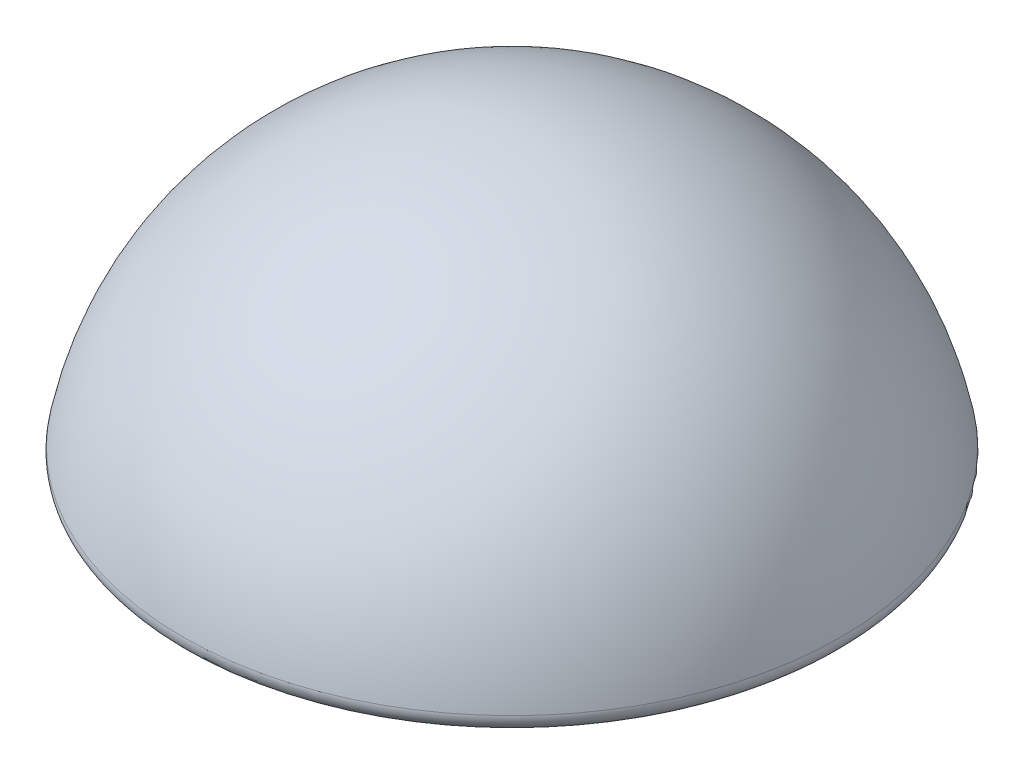
ISO-10303-21;
HEADER;
FILE_DESCRIPTION(('STEP AP214'),'2;1');
FILE_NAME('part.step','',(''),(''),'','','');
FILE_SCHEMA(('AUTOMOTIVE_DESIGN { 1 0 10303 214 1 1 1 1 }'));
ENDSEC;
DATA;
#1=APPLICATION_CONTEXT('core data for automotive mechanical design processes');
#2=APPLICATION_PROTOCOL_DEFINITION('international standard','automotive_design',2000,#1);
#3=PRODUCT_CONTEXT('',#1,'mechanical');
#4=PRODUCT('Part','Part','',(#3));
#5=PRODUCT_RELATED_PRODUCT_CATEGORY('part','',(#4));
#6=PRODUCT_DEFINITION_FORMATION('','',#4);
#7=PRODUCT_DEFINITION_CONTEXT('part definition',#1,'design');
#8=PRODUCT_DEFINITION('design','',#6,#7);
#9=PRODUCT_DEFINITION_SHAPE('','',#8);
#10=(LENGTH_UNIT() NAMED_UNIT(*) SI_UNIT(.MILLI.,.METRE.));
#11=(NAMED_UNIT(*) PLANE_ANGLE_UNIT() SI_UNIT($,.RADIAN.));
#12=(NAMED_UNIT(*) SI_UNIT($,.STERADIAN.) SOLID_ANGLE_UNIT());
#13=UNCERTAINTY_MEASURE_WITH_UNIT(LENGTH_MEASURE(1.E-05),#10,'distance_accuracy_value','');
#14=(GEOMETRIC_REPRESENTATION_CONTEXT(3) GLOBAL_UNCERTAINTY_ASSIGNED_CONTEXT((#13)) GLOBAL_UNIT_ASSIGNED_CONTEXT((#10,
#11,#12)) REPRESENTATION_CONTEXT('',''));
#15=CARTESIAN_POINT('',(0.,0.,0.));
#16=DIRECTION('',(0.,0.,1.));
#17=DIRECTION('',(1.,0.,0.));
#18=AXIS2_PLACEMENT_3D('',#15,#16,#17);
#19=CARTESIAN_POINT('',(0.,61.2522257059193,-40.1791717559268));
#20=DIRECTION('',(0.,-1.,0.));
#21=DIRECTION('',(0.,0.,-1.));
#22=AXIS2_PLACEMENT_3D('',#19,#20,#21);
#23=PLANE('',#22);
#24=DIRECTION('',(0.,0.,1.));
#25=VECTOR('',#24,1.);
#26=CARTESIAN_POINT('',(2.15,61.2522257059193,2.14999999999999));
#27=LINE('',#26,#25);
#28=CARTESIAN_POINT('',(2.15,61.2522257059193,-2.15000000000001));
#29=VERTEX_POINT('',#28);
#30=CARTESIAN_POINT('',(2.15,61.2522257059193,2.14999999999999));
#31=VERTEX_POINT('',#30);
#32=EDGE_CURVE('E61',#29,#31,#27,.T.);
#33=ORIENTED_EDGE('',*,*,#32,.F.);
#34=DIRECTION('',(1.,0.,0.));
#35=VECTOR('',#34,1.);
#36=CARTESIAN_POINT('',(-2.15,61.2522257059193,-2.15000000000001));
#37=LINE('',#36,#35);
#38=CARTESIAN_POINT('',(-2.15,61.2522257059193,-2.15000000000001));
#39=VERTEX_POINT('',#38);
#40=EDGE_CURVE('E133',#39,#29,#37,.T.);
#41=ORIENTED_EDGE('',*,*,#40,.F.);
#42=DIRECTION('',(0.,0.,-1.));
#43=VECTOR('',#42,1.);
#44=CARTESIAN_POINT('',(-2.15,61.2522257059193,2.14999999999999));
#45=LINE('',#44,#43);
#46=CARTESIAN_POINT('',(-2.15,61.2522257059193,2.14999999999999));
#47=VERTEX_POINT('',#46);
#48=EDGE_CURVE('E137',#47,#39,#45,.T.);
#49=ORIENTED_EDGE('',*,*,#48,.F.);
#50=DIRECTION('',(-1.,0.,0.));
#51=VECTOR('',#50,1.);
#52=CARTESIAN_POINT('',(-2.15,61.2522257059193,2.14999999999999));
#53=LINE('',#52,#51);
#54=EDGE_CURVE('E146',#31,#47,#53,.T.);
#55=ORIENTED_EDGE('',*,*,#54,.F.);
#56=EDGE_LOOP('',(#33,#41,#49,#55));
#57=FACE_BOUND('',#56,.T.);
#58=CARTESIAN_POINT('',(0.,61.2522257059193,0.));
#59=DIRECTION('',(0.,-1.,0.));
#60=DIRECTION('',(0.,0.,-1.));
#61=AXIS2_PLACEMENT_3D('',#58,#59,#60);
#62=CIRCLE('',#61,40.1791717559268);
#63=CARTESIAN_POINT('',(-40.1791717559268,61.2522257059193,0.));
#64=VERTEX_POINT('',#63);
#65=EDGE_CURVE('E54',#64,#64,#62,.T.);
#66=ORIENTED_EDGE('',*,*,#65,.T.);
#67=EDGE_LOOP('',(#66));
#68=FACE_BOUND('',#67,.T.);
#69=ADVANCED_FACE('F45',(#57,#68),#23,.T.);
#70=CARTESIAN_POINT('',(0.,47.4,0.));
#71=DIRECTION('',(0.,1.,0.));
#72=DIRECTION('',(-1.,0.,0.));
#73=AXIS2_PLACEMENT_3D('',#70,#71,#72);
#74=SPHERICAL_SURFACE('',#73,46.5);
#75=CARTESIAN_POINT('',(0.,56.2522257059193,0.));
#76=DIRECTION('',(0.,1.,0.));
#77=DIRECTION('',(0.,0.,1.));
#78=AXIS2_PLACEMENT_3D('',#75,#76,#77);
#79=CIRCLE('',#78,45.6496232191621);
#80=CARTESIAN_POINT('',(0.,56.2522257059193,45.6496232191621));
#81=VERTEX_POINT('',#80);
#82=EDGE_CURVE('E202',#81,#81,#79,.T.);
#83=ORIENTED_EDGE('',*,*,#82,.T.);
#84=EDGE_LOOP('',(#83));
#85=FACE_BOUND('',#84,.T.);
#86=ADVANCED_FACE('F47',(#85),#74,.T.);
#87=CARTESIAN_POINT('',(0.,55.8714848153422,0.));
#88=DIRECTION('',(0.,1.,0.));
#89=DIRECTION('',(0.,0.,1.));
#90=AXIS2_PLACEMENT_3D('',#87,#88,#89);
#91=TOROIDAL_SURFACE('',#90,43.6861985645744,2.00000000000001);
#92=CARTESIAN_POINT('',(0.,55.490743924765,0.));
#93=DIRECTION('',(0.,1.,0.));
#94=DIRECTION('',(0.,0.,1.));
#95=AXIS2_PLACEMENT_3D('',#92,#93,#94);
#96=CIRCLE('',#95,41.7227739099868);
#97=CARTESIAN_POINT('',(-41.7227739099868,55.490743924765,0.));
#98=VERTEX_POINT('',#97);
#99=EDGE_CURVE('E198',#98,#98,#96,.T.);
#100=ORIENTED_EDGE('',*,*,#99,.T.);
#101=EDGE_LOOP('',(#100));
#102=FACE_BOUND('',#101,.T.);
#103=ORIENTED_EDGE('',*,*,#82,.F.);
#104=EDGE_LOOP('',(#103));
#105=FACE_BOUND('',#104,.T.);
#106=ADVANCED_FACE('F213',(#102,#105),#91,.T.);
#107=CARTESIAN_POINT('',(0.,47.4,0.));
#108=DIRECTION('',(0.,1.,0.));
#109=DIRECTION('',(-1.,0.,0.));
#110=AXIS2_PLACEMENT_3D('',#107,#108,#109);
#111=SPHERICAL_SURFACE('',#110,42.5);
#112=CARTESIAN_POINT('',(-40.1791717559268,61.2522257059193,0.));
#113=CARTESIAN_POINT('',(-40.1994394092559,61.1934382228565,0.));
#114=CARTESIAN_POINT('',(-40.2195780399443,61.1346062577808,0.));
#115=CARTESIAN_POINT('',(-40.2595968719595,61.016854498442,0.));
#116=CARTESIAN_POINT('',(-40.2794770732863,60.9579347041788,0.));
#117=CARTESIAN_POINT('',(-40.3189786624983,60.8400084213034,0.));
#118=CARTESIAN_POINT('',(-40.3386000503835,60.781001932691,0.));
#119=CARTESIAN_POINT('',(-40.3775836349528,60.6629033980792,0.));
#120=CARTESIAN_POINT('',(-40.3969458316369,60.6038113520798,0.));
#121=CARTESIAN_POINT('',(-40.4354106606811,60.4855428411826,0.));
#122=CARTESIAN_POINT('',(-40.4545132930411,60.426366376285,0.));
#123=CARTESIAN_POINT('',(-40.4924586254105,60.3079301677395,0.));
#124=CARTESIAN_POINT('',(-40.51130132542,60.2486704240916,0.));
#125=CARTESIAN_POINT('',(-40.5487264300445,60.1300687997895,0.));
#126=CARTESIAN_POINT('',(-40.5673088346595,60.0707269191353,0.));
#127=CARTESIAN_POINT('',(-40.604212990473,59.9519621641491,0.));
#128=CARTESIAN_POINT('',(-40.6225347416715,59.8925392898171,0.));
#129=CARTESIAN_POINT('',(-40.6589172376501,59.7736136923638,0.));
#130=CARTESIAN_POINT('',(-40.6769779824302,59.7141109692425,0.));
#131=CARTESIAN_POINT('',(-40.7128381175994,59.5950268206379,0.));
#132=CARTESIAN_POINT('',(-40.7306375079885,59.5354453951544,0.));
#133=CARTESIAN_POINT('',(-40.7659745914382,59.4162049897689,0.));
#134=CARTESIAN_POINT('',(-40.7835122844989,59.3565460098667,0.));
#135=CARTESIAN_POINT('',(-40.8183256353967,59.2371516450813,0.));
#136=CARTESIAN_POINT('',(-40.8356012932338,59.177416260198,0.));
#137=CARTESIAN_POINT('',(-40.8698902408377,59.05787023636,0.));
#138=CARTESIAN_POINT('',(-40.8869035306046,58.9980595974054,0.));
#139=CARTESIAN_POINT('',(-40.9206674142764,58.8783642177842,0.));
#140=CARTESIAN_POINT('',(-40.9374180081814,58.8184794771178,0.));
#141=CARTESIAN_POINT('',(-40.9706561773991,58.6986370478604,0.));
#142=CARTESIAN_POINT('',(-40.9871437527118,58.6386793592695,0.));
#143=CARTESIAN_POINT('',(-41.0198555670822,58.518692189356,0.));
#144=CARTESIAN_POINT('',(-41.0360798061399,58.4586627080335,0.));
#145=CARTESIAN_POINT('',(-41.068264635411,58.3385331092327,0.));
#146=CARTESIAN_POINT('',(-41.0842252256245,58.2784329917545,0.));
#147=CARTESIAN_POINT('',(-41.1158824496977,58.1581632785793,0.));
#148=CARTESIAN_POINT('',(-41.1315790835575,58.0979936828824,0.));
#149=CARTESIAN_POINT('',(-41.1627080924993,57.9775861725454,0.));
#150=CARTESIAN_POINT('',(-41.1781404675814,57.9173482579054,0.));
#151=CARTESIAN_POINT('',(-41.2087406616356,57.796805270274,0.));
#152=CARTESIAN_POINT('',(-41.2239084806076,57.7365001972827,0.));
#153=CARTESIAN_POINT('',(-41.2539792702061,57.6158240548345,0.));
#154=CARTESIAN_POINT('',(-41.2688822408327,57.5554529853777,0.));
#155=CARTESIAN_POINT('',(-41.2984230466078,57.4346460131558,0.));
#156=CARTESIAN_POINT('',(-41.3130608817564,57.3742101103908,0.));
#157=CARTESIAN_POINT('',(-41.3420711345513,57.2532746359591,0.));
#158=CARTESIAN_POINT('',(-41.3564435521976,57.1927750642924,0.));
#159=CARTESIAN_POINT('',(-41.3849226930775,57.0717134176904,0.));
#160=CARTESIAN_POINT('',(-41.3990294163111,57.0111513427551,0.));
#161=CARTESIAN_POINT('',(-41.4269768965741,56.8899658564533,0.));
#162=CARTESIAN_POINT('',(-41.4408176536034,56.8293424450868,0.));
#163=CARTESIAN_POINT('',(-41.4682329347912,56.7080354539418,0.));
#164=CARTESIAN_POINT('',(-41.4818074589497,56.6473518741633,0.));
#165=CARTESIAN_POINT('',(-41.5086900128564,56.5259257153725,0.));
#166=CARTESIAN_POINT('',(-41.5219980426048,56.4651831363602,0.));
#167=CARTESIAN_POINT('',(-41.5483473512938,56.3436401494178,0.));
#168=CARTESIAN_POINT('',(-41.5613886302346,56.2828397414878,0.));
#169=CARTESIAN_POINT('',(-41.5872041860238,56.1611822681353,0.));
#170=CARTESIAN_POINT('',(-41.5999784628722,56.1003252027128,0.));
#171=CARTESIAN_POINT('',(-41.6252597684356,55.9785555869117,0.));
#172=CARTESIAN_POINT('',(-41.6377667971506,55.9176430365332,0.));
#173=CARTESIAN_POINT('',(-41.6625133651845,55.7957636243519,0.));
#174=CARTESIAN_POINT('',(-41.6747529045035,55.7347967625493,0.));
#175=CARTESIAN_POINT('',(-41.6989642590189,55.6128099023725,0.));
#176=CARTESIAN_POINT('',(-41.7109360742152,55.5517899039984,0.));
#177=CARTESIAN_POINT('',(-41.7227739099868,55.490743924765,0.));
#178=B_SPLINE_CURVE_WITH_KNOTS('',3,(#112,#113,#114,#115,#116,#117,#118,#119,#120,#121,#122,
#123,#124,#125,#126,#127,#128,#129,#130,#131,#132,#133,#134,#135,#136,#137,#138,#139,#140,#141,
#142,#143,#144,#145,#146,#147,#148,#149,#150,#151,#152,#153,#154,#155,#156,#157,#158,#159,#160,
#161,#162,#163,#164,#165,#166,#167,#168,#169,#170,#171,#172,#173,#174,#175,#176,#177),
.UNSPECIFIED.,.F.,.F.,(4,2,2,2,2,2,2,2,2,2,2,2,2,2,2,2,2,2,2,2,2,2,2,2,2,2,2,2,2,2,2,2,4),(0.,
0.186549343465838,0.373098686931691,0.559648030397529,0.746197373863375,0.932746717329217,
1.11929606079507,1.3058454042609,1.49239474772675,1.67894409119259,1.86549343465844,
2.05204277812429,2.23859212159013,2.42514146505597,2.61169080852182,2.79824015198766,
2.98478949545351,3.17133883891935,3.3578881823852,3.54443752585104,3.73098686931688,
3.91753621278273,4.10408555624858,4.29063489971442,4.47718424318026,4.6637335866461,
4.85028293011195,5.03683227357779,5.22338161704363,5.40993096050949,5.59648030397532,
5.78302964744117,5.96957899090702),.UNSPECIFIED.);
#179=EDGE_CURVE('BSEAM210',#64,#98,#178,.T.);
#180=ORIENTED_EDGE('',*,*,#65,.F.);
#181=ORIENTED_EDGE('',*,*,#99,.F.);
#182=ORIENTED_EDGE('',*,*,#179,.T.);
#183=ORIENTED_EDGE('',*,*,#179,.F.);
#184=EDGE_LOOP('',(#180,#182,#181,#183));
#185=FACE_BOUND('',#184,.T.);
#186=ADVANCED_FACE('F210',(#185),#111,.F.);
#187=CARTESIAN_POINT('',(2.15,64.2522257059193,2.14999999999999));
#188=DIRECTION('',(1.,0.,0.));
#189=DIRECTION('',(0.,0.,-1.));
#190=AXIS2_PLACEMENT_3D('',#187,#188,#189);
#191=PLANE('',#190);
#192=ORIENTED_EDGE('',*,*,#32,.T.);
#193=DIRECTION('',(0.,-1.,0.));
#194=VECTOR('',#193,1.);
#195=CARTESIAN_POINT('',(2.15,64.2522257059193,2.14999999999999));
#196=LINE('',#195,#194);
#197=CARTESIAN_POINT('',(2.15,64.2522257059193,2.14999999999999));
#198=VERTEX_POINT('',#197);
#199=EDGE_CURVE('E108',#198,#31,#196,.T.);
#200=ORIENTED_EDGE('',*,*,#199,.F.);
#201=DIRECTION('',(0.,0.,1.));
#202=VECTOR('',#201,1.);
#203=CARTESIAN_POINT('',(2.15,64.2522257059193,2.14999999999999));
#204=LINE('',#203,#202);
#205=CARTESIAN_POINT('',(2.15,64.2522257059193,-2.15000000000001));
#206=VERTEX_POINT('',#205);
#207=EDGE_CURVE('E112',#206,#198,#204,.T.);
#208=ORIENTED_EDGE('',*,*,#207,.F.);
#209=DIRECTION('',(0.,-1.,0.));
#210=VECTOR('',#209,1.);
#211=CARTESIAN_POINT('',(2.15,64.2522257059193,-2.15000000000001));
#212=LINE('',#211,#210);
#213=EDGE_CURVE('E152',#206,#29,#212,.T.);
#214=ORIENTED_EDGE('',*,*,#213,.T.);
#215=EDGE_LOOP('',(#192,#200,#208,#214));
#216=FACE_BOUND('',#215,.T.);
#217=ADVANCED_FACE('F110',(#216),#191,.F.);
#218=CARTESIAN_POINT('',(-2.15,64.2522257059193,-2.15000000000001));
#219=DIRECTION('',(0.,0.,-1.));
#220=DIRECTION('',(0.,1.,0.));
#221=AXIS2_PLACEMENT_3D('',#218,#219,#220);
#222=PLANE('',#221);
#223=ORIENTED_EDGE('',*,*,#40,.T.);
#224=ORIENTED_EDGE('',*,*,#213,.F.);
#225=DIRECTION('',(1.,0.,0.));
#226=VECTOR('',#225,1.);
#227=CARTESIAN_POINT('',(-2.15,64.2522257059193,-2.15000000000001));
#228=LINE('',#227,#226);
#229=CARTESIAN_POINT('',(-2.15,64.2522257059193,-2.15000000000001));
#230=VERTEX_POINT('',#229);
#231=EDGE_CURVE('E119',#230,#206,#228,.T.);
#232=ORIENTED_EDGE('',*,*,#231,.F.);
#233=DIRECTION('',(0.,-1.,0.));
#234=VECTOR('',#233,1.);
#235=CARTESIAN_POINT('',(-2.15,64.2522257059193,-2.15000000000001));
#236=LINE('',#235,#234);
#237=EDGE_CURVE('E156',#230,#39,#236,.T.);
#238=ORIENTED_EDGE('',*,*,#237,.T.);
#239=EDGE_LOOP('',(#223,#224,#232,#238));
#240=FACE_BOUND('',#239,.T.);
#241=ADVANCED_FACE('F252',(#240),#222,.F.);
#242=CARTESIAN_POINT('',(-2.15,64.2522257059193,2.14999999999999));
#243=DIRECTION('',(-1.,0.,0.));
#244=DIRECTION('',(0.,0.,1.));
#245=AXIS2_PLACEMENT_3D('',#242,#243,#244);
#246=PLANE('',#245);
#247=ORIENTED_EDGE('',*,*,#48,.T.);
#248=ORIENTED_EDGE('',*,*,#237,.F.);
#249=DIRECTION('',(0.,0.,-1.));
#250=VECTOR('',#249,1.);
#251=CARTESIAN_POINT('',(-2.15,64.2522257059193,2.14999999999999));
#252=LINE('',#251,#250);
#253=CARTESIAN_POINT('',(-2.15,64.2522257059193,2.14999999999999));
#254=VERTEX_POINT('',#253);
#255=EDGE_CURVE('E128',#254,#230,#252,.T.);
#256=ORIENTED_EDGE('',*,*,#255,.F.);
#257=DIRECTION('',(0.,-1.,0.));
#258=VECTOR('',#257,1.);
#259=CARTESIAN_POINT('',(-2.15,64.2522257059193,2.14999999999999));
#260=LINE('',#259,#258);
#261=EDGE_CURVE('E118',#254,#47,#260,.T.);
#262=ORIENTED_EDGE('',*,*,#261,.T.);
#263=EDGE_LOOP('',(#247,#248,#256,#262));
#264=FACE_BOUND('',#263,.T.);
#265=ADVANCED_FACE('F255',(#264),#246,.F.);
#266=CARTESIAN_POINT('',(-2.15,64.2522257059193,2.14999999999999));
#267=DIRECTION('',(0.,0.,1.));
#268=DIRECTION('',(0.,-1.,0.));
#269=AXIS2_PLACEMENT_3D('',#266,#267,#268);
#270=PLANE('',#269);
#271=ORIENTED_EDGE('',*,*,#54,.T.);
#272=ORIENTED_EDGE('',*,*,#261,.F.);
#273=DIRECTION('',(-1.,0.,0.));
#274=VECTOR('',#273,1.);
#275=CARTESIAN_POINT('',(-2.15,64.2522257059193,2.14999999999999));
#276=LINE('',#275,#274);
#277=EDGE_CURVE('E122',#198,#254,#276,.T.);
#278=ORIENTED_EDGE('',*,*,#277,.F.);
#279=ORIENTED_EDGE('',*,*,#199,.T.);
#280=EDGE_LOOP('',(#271,#272,#278,#279));
#281=FACE_BOUND('',#280,.T.);
#282=ADVANCED_FACE('F123',(#281),#270,.F.);
#283=CARTESIAN_POINT('',(0.,64.2522257059193,0.));
#284=DIRECTION('',(0.,-1.,0.));
#285=DIRECTION('',(0.,0.,-1.));
#286=AXIS2_PLACEMENT_3D('',#283,#284,#285);
#287=PLANE('',#286);
#288=DIRECTION('',(1.,0.,0.));
#289=VECTOR('',#288,1.);
#290=CARTESIAN_POINT('',(-1.7,64.2522257059193,-1.70000000000001));
#291=LINE('',#290,#289);
#292=CARTESIAN_POINT('',(-1.7,64.2522257059193,-1.70000000000001));
#293=VERTEX_POINT('',#292);
#294=CARTESIAN_POINT('',(1.7,64.2522257059193,-1.70000000000001));
#295=VERTEX_POINT('',#294);
#296=EDGE_CURVE('E11',#293,#295,#291,.T.);
#297=ORIENTED_EDGE('',*,*,#296,.F.);
#298=DIRECTION('',(0.,0.,-1.));
#299=VECTOR('',#298,1.);
#300=CARTESIAN_POINT('',(-1.7,64.2522257059193,1.7));
#301=LINE('',#300,#299);
#302=CARTESIAN_POINT('',(-1.7,64.2522257059193,1.69999999999999));
#303=VERTEX_POINT('',#302);
#304=EDGE_CURVE('E155',#303,#293,#301,.T.);
#305=ORIENTED_EDGE('',*,*,#304,.F.);
#306=DIRECTION('',(-1.,0.,0.));
#307=VECTOR('',#306,1.);
#308=CARTESIAN_POINT('',(-1.7,64.2522257059193,1.69999999999999));
#309=LINE('',#308,#307);
#310=CARTESIAN_POINT('',(1.7,64.2522257059193,1.69999999999999));
#311=VERTEX_POINT('',#310);
#312=EDGE_CURVE('E164',#311,#303,#309,.T.);
#313=ORIENTED_EDGE('',*,*,#312,.F.);
#314=DIRECTION('',(0.,0.,1.));
#315=VECTOR('',#314,1.);
#316=CARTESIAN_POINT('',(1.7,64.2522257059193,1.7));
#317=LINE('',#316,#315);
#318=EDGE_CURVE('E69',#295,#311,#317,.T.);
#319=ORIENTED_EDGE('',*,*,#318,.F.);
#320=EDGE_LOOP('',(#297,#305,#313,#319));
#321=FACE_BOUND('',#320,.T.);
#322=ORIENTED_EDGE('',*,*,#207,.T.);
#323=ORIENTED_EDGE('',*,*,#277,.T.);
#324=ORIENTED_EDGE('',*,*,#255,.T.);
#325=ORIENTED_EDGE('',*,*,#231,.T.);
#326=EDGE_LOOP('',(#322,#323,#324,#325));
#327=FACE_BOUND('',#326,.T.);
#328=ADVANCED_FACE('F130',(#321,#327),#287,.T.);
#329=CARTESIAN_POINT('',(0.,71.7522257059193,0.));
#330=DIRECTION('',(0.,-1.,0.));
#331=DIRECTION('',(0.,0.,-1.));
#332=AXIS2_PLACEMENT_3D('',#329,#330,#331);
#333=PLANE('',#332);
#334=DIRECTION('',(0.,0.,1.));
#335=VECTOR('',#334,1.);
#336=CARTESIAN_POINT('',(1.7,71.7522257059193,1.69999999999999));
#337=LINE('',#336,#335);
#338=CARTESIAN_POINT('',(1.7,71.7522257059193,-1.70000000000001));
#339=VERTEX_POINT('',#338);
#340=CARTESIAN_POINT('',(1.7,71.7522257059193,1.69999999999999));
#341=VERTEX_POINT('',#340);
#342=EDGE_CURVE('E170',#339,#341,#337,.T.);
#343=ORIENTED_EDGE('',*,*,#342,.T.);
#344=DIRECTION('',(-1.,0.,0.));
#345=VECTOR('',#344,1.);
#346=CARTESIAN_POINT('',(-1.7,71.7522257059193,1.69999999999999));
#347=LINE('',#346,#345);
#348=CARTESIAN_POINT('',(-1.7,71.7522257059193,1.69999999999999));
#349=VERTEX_POINT('',#348);
#350=EDGE_CURVE('E174',#341,#349,#347,.T.);
#351=ORIENTED_EDGE('',*,*,#350,.T.);
#352=DIRECTION('',(0.,0.,-1.));
#353=VECTOR('',#352,1.);
#354=CARTESIAN_POINT('',(-1.7,71.7522257059193,1.69999999999999));
#355=LINE('',#354,#353);
#356=CARTESIAN_POINT('',(-1.7,71.7522257059193,-1.70000000000001));
#357=VERTEX_POINT('',#356);
#358=EDGE_CURVE('E178',#349,#357,#355,.T.);
#359=ORIENTED_EDGE('',*,*,#358,.T.);
#360=DIRECTION('',(1.,0.,0.));
#361=VECTOR('',#360,1.);
#362=CARTESIAN_POINT('',(-1.7,71.7522257059193,-1.70000000000001));
#363=LINE('',#362,#361);
#364=EDGE_CURVE('E182',#357,#339,#363,.T.);
#365=ORIENTED_EDGE('',*,*,#364,.T.);
#366=EDGE_LOOP('',(#343,#351,#359,#365));
#367=FACE_BOUND('',#366,.T.);
#368=ADVANCED_FACE('F245',(#367),#333,.T.);
#369=CARTESIAN_POINT('',(-1.7,55.2522257059193,-1.70000000000001));
#370=DIRECTION('',(0.,0.,1.));
#371=DIRECTION('',(0.,-1.,0.));
#372=AXIS2_PLACEMENT_3D('',#369,#370,#371);
#373=PLANE('',#372);
#374=DIRECTION('',(0.,1.,0.));
#375=VECTOR('',#374,1.);
#376=CARTESIAN_POINT('',(-1.7,55.2522257059193,-1.70000000000001));
#377=LINE('',#376,#375);
#378=EDGE_CURVE('E189',#293,#357,#377,.T.);
#379=ORIENTED_EDGE('',*,*,#378,.F.);
#380=ORIENTED_EDGE('',*,*,#296,.T.);
#381=DIRECTION('',(0.,1.,0.));
#382=VECTOR('',#381,1.);
#383=CARTESIAN_POINT('',(1.7,55.2522257059193,-1.70000000000001));
#384=LINE('',#383,#382);
#385=EDGE_CURVE('E186',#295,#339,#384,.T.);
#386=ORIENTED_EDGE('',*,*,#385,.T.);
#387=ORIENTED_EDGE('',*,*,#364,.F.);
#388=EDGE_LOOP('',(#379,#380,#386,#387));
#389=FACE_BOUND('',#388,.T.);
#390=ADVANCED_FACE('F241',(#389),#373,.T.);
#391=CARTESIAN_POINT('',(-1.7,55.2522257059193,1.7));
#392=DIRECTION('',(1.,0.,0.));
#393=DIRECTION('',(0.,0.,-1.));
#394=AXIS2_PLACEMENT_3D('',#391,#392,#393);
#395=PLANE('',#394);
#396=DIRECTION('',(0.,1.,0.));
#397=VECTOR('',#396,1.);
#398=CARTESIAN_POINT('',(-1.7,55.2522257059193,1.7));
#399=LINE('',#398,#397);
#400=EDGE_CURVE('E192',#303,#349,#399,.T.);
#401=ORIENTED_EDGE('',*,*,#400,.F.);
#402=ORIENTED_EDGE('',*,*,#304,.T.);
#403=ORIENTED_EDGE('',*,*,#378,.T.);
#404=ORIENTED_EDGE('',*,*,#358,.F.);
#405=EDGE_LOOP('',(#401,#402,#403,#404));
#406=FACE_BOUND('',#405,.T.);
#407=ADVANCED_FACE('F237',(#406),#395,.T.);
#408=CARTESIAN_POINT('',(-1.7,55.2522257059193,1.7));
#409=DIRECTION('',(0.,0.,-1.));
#410=DIRECTION('',(0.,1.,0.));
#411=AXIS2_PLACEMENT_3D('',#408,#409,#410);
#412=PLANE('',#411);
#413=DIRECTION('',(0.,1.,0.));
#414=VECTOR('',#413,1.);
#415=CARTESIAN_POINT('',(1.7,55.2522257059193,1.7));
#416=LINE('',#415,#414);
#417=EDGE_CURVE('E195',#311,#341,#416,.T.);
#418=ORIENTED_EDGE('',*,*,#417,.F.);
#419=ORIENTED_EDGE('',*,*,#312,.T.);
#420=ORIENTED_EDGE('',*,*,#400,.T.);
#421=ORIENTED_EDGE('',*,*,#350,.F.);
#422=EDGE_LOOP('',(#418,#419,#420,#421));
#423=FACE_BOUND('',#422,.T.);
#424=ADVANCED_FACE('F233',(#423),#412,.T.);
#425=CARTESIAN_POINT('',(1.7,55.2522257059193,1.7));
#426=DIRECTION('',(-1.,0.,0.));
#427=DIRECTION('',(0.,0.,1.));
#428=AXIS2_PLACEMENT_3D('',#425,#426,#427);
#429=PLANE('',#428);
#430=ORIENTED_EDGE('',*,*,#385,.F.);
#431=ORIENTED_EDGE('',*,*,#318,.T.);
#432=ORIENTED_EDGE('',*,*,#417,.T.);
#433=ORIENTED_EDGE('',*,*,#342,.F.);
#434=EDGE_LOOP('',(#430,#431,#432,#433));
#435=FACE_BOUND('',#434,.T.);
#436=ADVANCED_FACE('F230',(#435),#429,.T.);
#437=CLOSED_SHELL('',(#69,#86,#106,#186,#217,#241,#265,#282,#328,#368,#390,#407,#424,#436));
#438=MANIFOLD_SOLID_BREP('B2',#437);
#439=ADVANCED_BREP_SHAPE_REPRESENTATION('',(#18,#438),#14);
#440=SHAPE_DEFINITION_REPRESENTATION(#9,#439);
ENDSEC;
END-ISO-10303-21;
